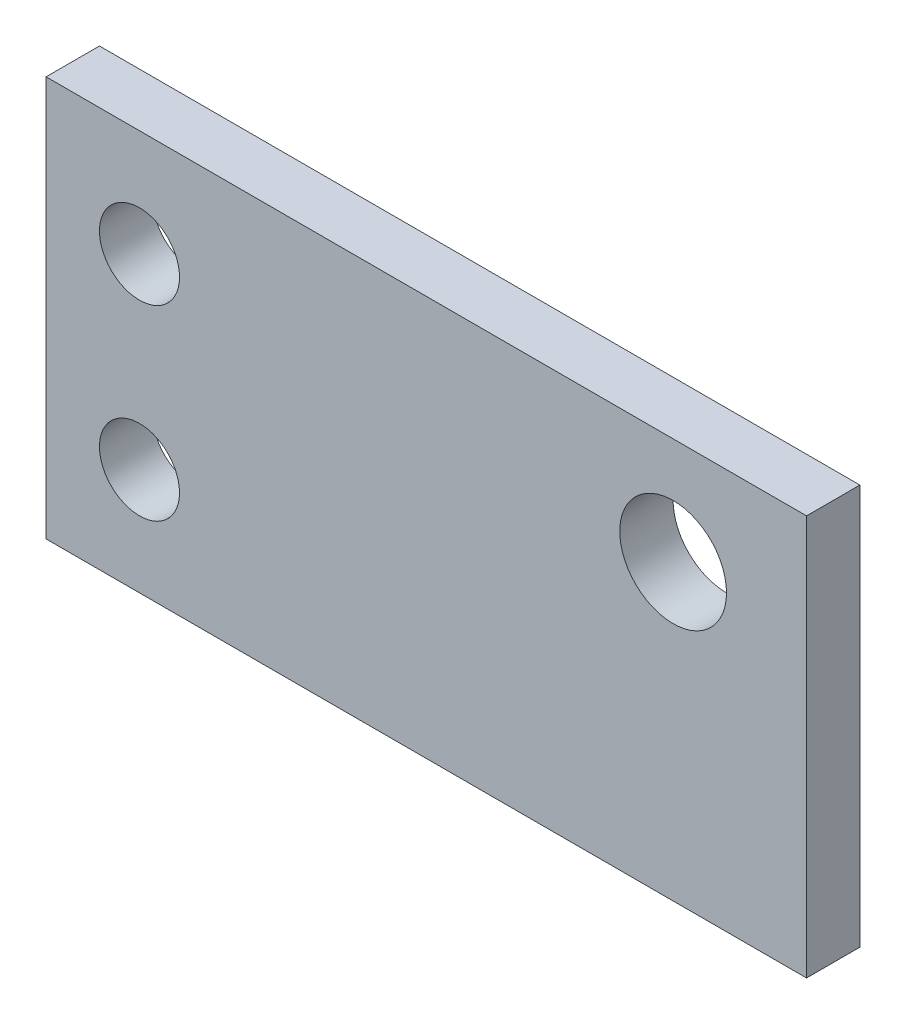
ISO-10303-21;
HEADER;
FILE_DESCRIPTION(('STEP AP214'),'2;1');
FILE_NAME('part.step','',(''),(''),'','','');
FILE_SCHEMA(('AUTOMOTIVE_DESIGN { 1 0 10303 214 1 1 1 1 }'));
ENDSEC;
DATA;
#1=APPLICATION_CONTEXT('core data for automotive mechanical design processes');
#2=APPLICATION_PROTOCOL_DEFINITION('international standard','automotive_design',2000,#1);
#3=PRODUCT_CONTEXT('',#1,'mechanical');
#4=PRODUCT('Part','Part','',(#3));
#5=PRODUCT_RELATED_PRODUCT_CATEGORY('part','',(#4));
#6=PRODUCT_DEFINITION_FORMATION('','',#4);
#7=PRODUCT_DEFINITION_CONTEXT('part definition',#1,'design');
#8=PRODUCT_DEFINITION('design','',#6,#7);
#9=PRODUCT_DEFINITION_SHAPE('','',#8);
#10=(LENGTH_UNIT() NAMED_UNIT(*) SI_UNIT(.MILLI.,.METRE.));
#11=(NAMED_UNIT(*) PLANE_ANGLE_UNIT() SI_UNIT($,.RADIAN.));
#12=(NAMED_UNIT(*) SI_UNIT($,.STERADIAN.) SOLID_ANGLE_UNIT());
#13=UNCERTAINTY_MEASURE_WITH_UNIT(LENGTH_MEASURE(1.E-05),#10,'distance_accuracy_value','');
#14=(GEOMETRIC_REPRESENTATION_CONTEXT(3) GLOBAL_UNCERTAINTY_ASSIGNED_CONTEXT((#13)) GLOBAL_UNIT_ASSIGNED_CONTEXT((#10,
#11,#12)) REPRESENTATION_CONTEXT('',''));
#15=CARTESIAN_POINT('',(0.,0.,0.));
#16=DIRECTION('',(0.,0.,1.));
#17=DIRECTION('',(1.,0.,0.));
#18=AXIS2_PLACEMENT_3D('',#15,#16,#17);
#19=CARTESIAN_POINT('',(-25.9540548008884,-4.99978947368421,2.));
#20=DIRECTION('',(0.,0.,1.));
#21=DIRECTION('',(1.,0.,0.));
#22=AXIS2_PLACEMENT_3D('',#19,#20,#21);
#23=PLANE('',#22);
#24=CARTESIAN_POINT('',(-22.4540548008884,6.00021052631579,2.));
#25=DIRECTION('',(0.,0.,1.));
#26=DIRECTION('',(1.,0.,0.));
#27=AXIS2_PLACEMENT_3D('',#24,#25,#26);
#28=CIRCLE('',#27,1.5);
#29=CARTESIAN_POINT('',(-20.9540548008884,6.00021052631579,2.));
#30=VERTEX_POINT('',#29);
#31=EDGE_CURVE('E113',#30,#30,#28,.T.);
#32=ORIENTED_EDGE('',*,*,#31,.F.);
#33=EDGE_LOOP('',(#32));
#34=FACE_BOUND('',#33,.T.);
#35=DIRECTION('',(0.,-1.,0.));
#36=VECTOR('',#35,1.);
#37=CARTESIAN_POINT('',(-25.9540548008884,10.0002105263158,2.));
#38=LINE('',#37,#36);
#39=CARTESIAN_POINT('',(-25.9540548008884,10.0002105263158,2.));
#40=VERTEX_POINT('',#39);
#41=CARTESIAN_POINT('',(-25.9540548008884,-4.99978947368421,2.));
#42=VERTEX_POINT('',#41);
#43=EDGE_CURVE('E83',#40,#42,#38,.T.);
#44=ORIENTED_EDGE('',*,*,#43,.T.);
#45=DIRECTION('',(1.,0.,0.));
#46=VECTOR('',#45,1.);
#47=CARTESIAN_POINT('',(-25.9540548008884,-4.99978947368421,2.));
#48=LINE('',#47,#46);
#49=CARTESIAN_POINT('',(2.54594519911162,-4.99978947368421,2.));
#50=VERTEX_POINT('',#49);
#51=EDGE_CURVE('E78',#42,#50,#48,.T.);
#52=ORIENTED_EDGE('',*,*,#51,.T.);
#53=DIRECTION('',(0.,1.,0.));
#54=VECTOR('',#53,1.);
#55=CARTESIAN_POINT('',(2.54594519911161,10.0002105263158,2.));
#56=LINE('',#55,#54);
#57=CARTESIAN_POINT('',(2.54594519911161,10.0002105263158,2.));
#58=VERTEX_POINT('',#57);
#59=EDGE_CURVE('E81',#50,#58,#56,.T.);
#60=ORIENTED_EDGE('',*,*,#59,.T.);
#61=DIRECTION('',(-1.,0.,0.));
#62=VECTOR('',#61,1.);
#63=CARTESIAN_POINT('',(-25.9540548008884,10.0002105263158,2.));
#64=LINE('',#63,#62);
#65=EDGE_CURVE('E48',#58,#40,#64,.T.);
#66=ORIENTED_EDGE('',*,*,#65,.T.);
#67=EDGE_LOOP('',(#44,#52,#60,#66));
#68=FACE_BOUND('',#67,.T.);
#69=CARTESIAN_POINT('',(-22.4540548008884,-0.999789473684207,2.));
#70=DIRECTION('',(0.,0.,1.));
#71=DIRECTION('',(1.,0.,0.));
#72=AXIS2_PLACEMENT_3D('',#69,#70,#71);
#73=CIRCLE('',#72,1.5);
#74=CARTESIAN_POINT('',(-20.9540548008884,-0.999789473684207,2.));
#75=VERTEX_POINT('',#74);
#76=EDGE_CURVE('E98',#75,#75,#73,.T.);
#77=ORIENTED_EDGE('',*,*,#76,.F.);
#78=EDGE_LOOP('',(#77));
#79=FACE_BOUND('',#78,.T.);
#80=CARTESIAN_POINT('',(-2.45405480088839,6.00021052631579,2.));
#81=DIRECTION('',(0.,0.,1.));
#82=DIRECTION('',(1.,0.,0.));
#83=AXIS2_PLACEMENT_3D('',#80,#81,#82);
#84=CIRCLE('',#83,2.);
#85=CARTESIAN_POINT('',(-0.454054800888387,6.00021052631579,2.));
#86=VERTEX_POINT('',#85);
#87=EDGE_CURVE('E119',#86,#86,#84,.T.);
#88=ORIENTED_EDGE('',*,*,#87,.F.);
#89=EDGE_LOOP('',(#88));
#90=FACE_BOUND('',#89,.T.);
#91=ADVANCED_FACE('F31',(#34,#68,#79,#90),#23,.T.);
#92=CARTESIAN_POINT('',(-25.9540548008884,-4.99978947368421,0.));
#93=DIRECTION('',(0.,0.,1.));
#94=DIRECTION('',(1.,0.,0.));
#95=AXIS2_PLACEMENT_3D('',#92,#93,#94);
#96=PLANE('',#95);
#97=CARTESIAN_POINT('',(-22.4540548008884,6.00021052631579,0.));
#98=DIRECTION('',(0.,0.,1.));
#99=DIRECTION('',(1.,0.,0.));
#100=AXIS2_PLACEMENT_3D('',#97,#98,#99);
#101=CIRCLE('',#100,1.5);
#102=CARTESIAN_POINT('',(-20.9540548008884,6.00021052631579,0.));
#103=VERTEX_POINT('',#102);
#104=EDGE_CURVE('E116',#103,#103,#101,.T.);
#105=ORIENTED_EDGE('',*,*,#104,.T.);
#106=EDGE_LOOP('',(#105));
#107=FACE_BOUND('',#106,.T.);
#108=DIRECTION('',(0.,-1.,0.));
#109=VECTOR('',#108,1.);
#110=CARTESIAN_POINT('',(-25.9540548008884,10.0002105263158,0.));
#111=LINE('',#110,#109);
#112=CARTESIAN_POINT('',(-25.9540548008884,10.0002105263158,0.));
#113=VERTEX_POINT('',#112);
#114=CARTESIAN_POINT('',(-25.9540548008884,-4.99978947368421,0.));
#115=VERTEX_POINT('',#114);
#116=EDGE_CURVE('E95',#113,#115,#111,.T.);
#117=ORIENTED_EDGE('',*,*,#116,.F.);
#118=DIRECTION('',(-1.,0.,0.));
#119=VECTOR('',#118,1.);
#120=CARTESIAN_POINT('',(-25.9540548008884,10.0002105263158,0.));
#121=LINE('',#120,#119);
#122=CARTESIAN_POINT('',(2.54594519911161,10.0002105263158,0.));
#123=VERTEX_POINT('',#122);
#124=EDGE_CURVE('E71',#123,#113,#121,.T.);
#125=ORIENTED_EDGE('',*,*,#124,.F.);
#126=DIRECTION('',(0.,1.,0.));
#127=VECTOR('',#126,1.);
#128=CARTESIAN_POINT('',(2.54594519911161,10.0002105263158,0.));
#129=LINE('',#128,#127);
#130=CARTESIAN_POINT('',(2.54594519911162,-4.99978947368421,0.));
#131=VERTEX_POINT('',#130);
#132=EDGE_CURVE('E65',#131,#123,#129,.T.);
#133=ORIENTED_EDGE('',*,*,#132,.F.);
#134=DIRECTION('',(1.,0.,0.));
#135=VECTOR('',#134,1.);
#136=CARTESIAN_POINT('',(-25.9540548008884,-4.99978947368421,0.));
#137=LINE('',#136,#135);
#138=EDGE_CURVE('E87',#115,#131,#137,.T.);
#139=ORIENTED_EDGE('',*,*,#138,.F.);
#140=EDGE_LOOP('',(#117,#125,#133,#139));
#141=FACE_BOUND('',#140,.T.);
#142=CARTESIAN_POINT('',(-22.4540548008884,-0.999789473684207,0.));
#143=DIRECTION('',(0.,0.,1.));
#144=DIRECTION('',(1.,0.,0.));
#145=AXIS2_PLACEMENT_3D('',#142,#143,#144);
#146=CIRCLE('',#145,1.5);
#147=CARTESIAN_POINT('',(-20.9540548008884,-0.999789473684207,0.));
#148=VERTEX_POINT('',#147);
#149=EDGE_CURVE('E110',#148,#148,#146,.T.);
#150=ORIENTED_EDGE('',*,*,#149,.T.);
#151=EDGE_LOOP('',(#150));
#152=FACE_BOUND('',#151,.T.);
#153=CARTESIAN_POINT('',(-2.45405480088839,6.00021052631579,0.));
#154=DIRECTION('',(0.,0.,1.));
#155=DIRECTION('',(1.,0.,0.));
#156=AXIS2_PLACEMENT_3D('',#153,#154,#155);
#157=CIRCLE('',#156,2.);
#158=CARTESIAN_POINT('',(-0.454054800888387,6.00021052631579,0.));
#159=VERTEX_POINT('',#158);
#160=EDGE_CURVE('E122',#159,#159,#157,.T.);
#161=ORIENTED_EDGE('',*,*,#160,.T.);
#162=EDGE_LOOP('',(#161));
#163=FACE_BOUND('',#162,.T.);
#164=ADVANCED_FACE('F106',(#107,#141,#152,#163),#96,.F.);
#165=CARTESIAN_POINT('',(-25.9540548008884,10.0002105263158,2.));
#166=DIRECTION('',(1.,0.,0.));
#167=DIRECTION('',(0.,0.,-1.));
#168=AXIS2_PLACEMENT_3D('',#165,#166,#167);
#169=PLANE('',#168);
#170=ORIENTED_EDGE('',*,*,#116,.T.);
#171=DIRECTION('',(0.,0.,-1.));
#172=VECTOR('',#171,1.);
#173=CARTESIAN_POINT('',(-25.9540548008884,-4.99978947368421,2.));
#174=LINE('',#173,#172);
#175=EDGE_CURVE('E11',#42,#115,#174,.T.);
#176=ORIENTED_EDGE('',*,*,#175,.F.);
#177=ORIENTED_EDGE('',*,*,#43,.F.);
#178=DIRECTION('',(0.,0.,-1.));
#179=VECTOR('',#178,1.);
#180=CARTESIAN_POINT('',(-25.9540548008884,10.0002105263158,2.));
#181=LINE('',#180,#179);
#182=EDGE_CURVE('E91',#40,#113,#181,.T.);
#183=ORIENTED_EDGE('',*,*,#182,.T.);
#184=EDGE_LOOP('',(#170,#176,#177,#183));
#185=FACE_BOUND('',#184,.T.);
#186=ADVANCED_FACE('F33',(#185),#169,.F.);
#187=CARTESIAN_POINT('',(-25.9540548008884,-4.99978947368421,2.));
#188=DIRECTION('',(0.,1.,0.));
#189=DIRECTION('',(0.,0.,1.));
#190=AXIS2_PLACEMENT_3D('',#187,#188,#189);
#191=PLANE('',#190);
#192=ORIENTED_EDGE('',*,*,#138,.T.);
#193=DIRECTION('',(0.,0.,-1.));
#194=VECTOR('',#193,1.);
#195=CARTESIAN_POINT('',(2.54594519911162,-4.99978947368421,2.));
#196=LINE('',#195,#194);
#197=EDGE_CURVE('E40',#50,#131,#196,.T.);
#198=ORIENTED_EDGE('',*,*,#197,.F.);
#199=ORIENTED_EDGE('',*,*,#51,.F.);
#200=ORIENTED_EDGE('',*,*,#175,.T.);
#201=EDGE_LOOP('',(#192,#198,#199,#200));
#202=FACE_BOUND('',#201,.T.);
#203=ADVANCED_FACE('F86',(#202),#191,.F.);
#204=CARTESIAN_POINT('',(2.54594519911161,10.0002105263158,2.));
#205=DIRECTION('',(-1.,0.,0.));
#206=DIRECTION('',(0.,-1.,0.));
#207=AXIS2_PLACEMENT_3D('',#204,#205,#206);
#208=PLANE('',#207);
#209=ORIENTED_EDGE('',*,*,#132,.T.);
#210=DIRECTION('',(0.,0.,-1.));
#211=VECTOR('',#210,1.);
#212=CARTESIAN_POINT('',(2.54594519911161,10.0002105263158,2.));
#213=LINE('',#212,#211);
#214=EDGE_CURVE('E88',#58,#123,#213,.T.);
#215=ORIENTED_EDGE('',*,*,#214,.F.);
#216=ORIENTED_EDGE('',*,*,#59,.F.);
#217=ORIENTED_EDGE('',*,*,#197,.T.);
#218=EDGE_LOOP('',(#209,#215,#216,#217));
#219=FACE_BOUND('',#218,.T.);
#220=ADVANCED_FACE('F89',(#219),#208,.F.);
#221=CARTESIAN_POINT('',(-25.9540548008884,10.0002105263158,2.));
#222=DIRECTION('',(0.,-1.,0.));
#223=DIRECTION('',(0.,0.,-1.));
#224=AXIS2_PLACEMENT_3D('',#221,#222,#223);
#225=PLANE('',#224);
#226=ORIENTED_EDGE('',*,*,#124,.T.);
#227=ORIENTED_EDGE('',*,*,#182,.F.);
#228=ORIENTED_EDGE('',*,*,#65,.F.);
#229=ORIENTED_EDGE('',*,*,#214,.T.);
#230=EDGE_LOOP('',(#226,#227,#228,#229));
#231=FACE_BOUND('',#230,.T.);
#232=ADVANCED_FACE('F103',(#231),#225,.F.);
#233=CARTESIAN_POINT('',(-22.4540548008884,-0.999789473684207,2.));
#234=DIRECTION('',(0.,0.,-1.));
#235=DIRECTION('',(-1.,0.,0.));
#236=AXIS2_PLACEMENT_3D('',#233,#234,#235);
#237=CYLINDRICAL_SURFACE('',#236,1.5);
#238=ORIENTED_EDGE('',*,*,#76,.T.);
#239=EDGE_LOOP('',(#238));
#240=FACE_BOUND('',#239,.T.);
#241=ORIENTED_EDGE('',*,*,#149,.F.);
#242=EDGE_LOOP('',(#241));
#243=FACE_BOUND('',#242,.T.);
#244=ADVANCED_FACE('F141',(#240,#243),#237,.F.);
#245=CARTESIAN_POINT('',(-22.4540548008884,6.00021052631579,2.));
#246=DIRECTION('',(0.,0.,-1.));
#247=DIRECTION('',(-1.,0.,0.));
#248=AXIS2_PLACEMENT_3D('',#245,#246,#247);
#249=CYLINDRICAL_SURFACE('',#248,1.5);
#250=ORIENTED_EDGE('',*,*,#31,.T.);
#251=EDGE_LOOP('',(#250));
#252=FACE_BOUND('',#251,.T.);
#253=ORIENTED_EDGE('',*,*,#104,.F.);
#254=EDGE_LOOP('',(#253));
#255=FACE_BOUND('',#254,.T.);
#256=ADVANCED_FACE('F187',(#252,#255),#249,.F.);
#257=CARTESIAN_POINT('',(-2.45405480088839,6.00021052631579,2.));
#258=DIRECTION('',(0.,0.,-1.));
#259=DIRECTION('',(-1.,0.,0.));
#260=AXIS2_PLACEMENT_3D('',#257,#258,#259);
#261=CYLINDRICAL_SURFACE('',#260,2.);
#262=ORIENTED_EDGE('',*,*,#87,.T.);
#263=EDGE_LOOP('',(#262));
#264=FACE_BOUND('',#263,.T.);
#265=ORIENTED_EDGE('',*,*,#160,.F.);
#266=EDGE_LOOP('',(#265));
#267=FACE_BOUND('',#266,.T.);
#268=ADVANCED_FACE('F128',(#264,#267),#261,.F.);
#269=CLOSED_SHELL('',(#91,#164,#186,#203,#220,#232,#244,#256,#268));
#270=MANIFOLD_SOLID_BREP('B2',#269);
#271=ADVANCED_BREP_SHAPE_REPRESENTATION('',(#18,#270),#14);
#272=SHAPE_DEFINITION_REPRESENTATION(#9,#271);
ENDSEC;
END-ISO-10303-21;
